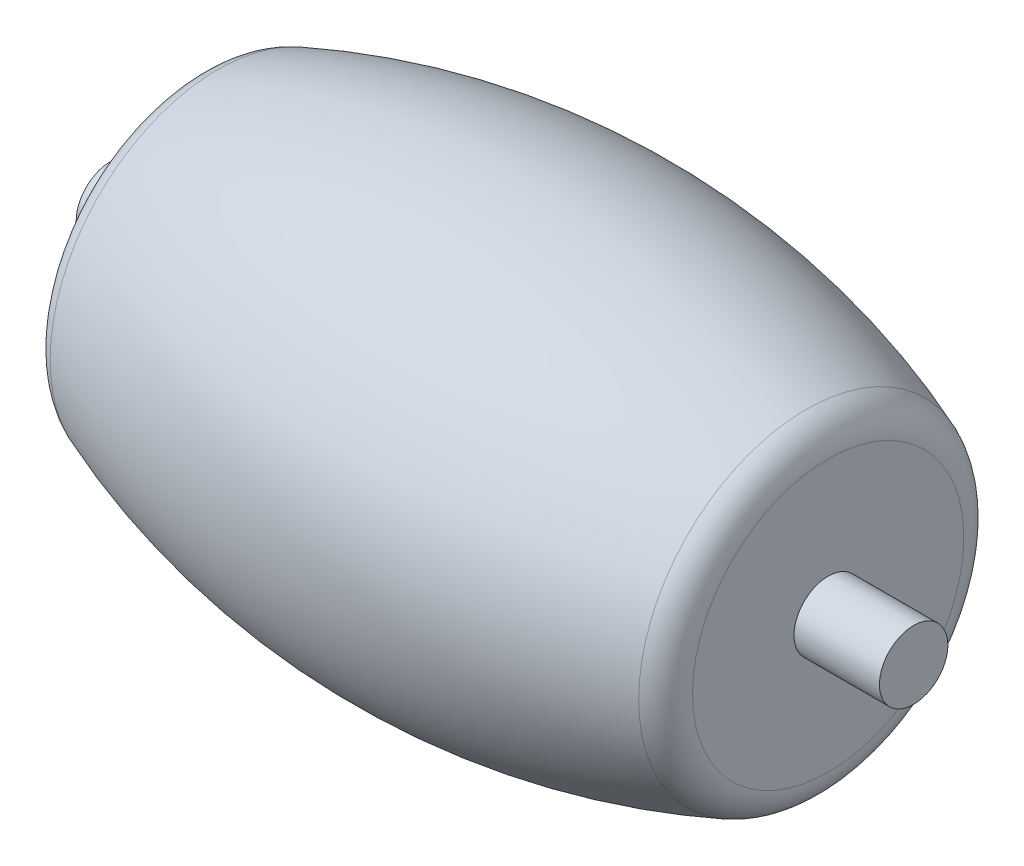
ISO-10303-21;
HEADER;
FILE_DESCRIPTION(('STEP AP214'),'2;1');
FILE_NAME('part.step','',(''),(''),'','','');
FILE_SCHEMA(('AUTOMOTIVE_DESIGN { 1 0 10303 214 1 1 1 1 }'));
ENDSEC;
DATA;
#1=APPLICATION_CONTEXT('core data for automotive mechanical design processes');
#2=APPLICATION_PROTOCOL_DEFINITION('international standard','automotive_design',2000,#1);
#3=PRODUCT_CONTEXT('',#1,'mechanical');
#4=PRODUCT('Part','Part','',(#3));
#5=PRODUCT_RELATED_PRODUCT_CATEGORY('part','',(#4));
#6=PRODUCT_DEFINITION_FORMATION('','',#4);
#7=PRODUCT_DEFINITION_CONTEXT('part definition',#1,'design');
#8=PRODUCT_DEFINITION('design','',#6,#7);
#9=PRODUCT_DEFINITION_SHAPE('','',#8);
#10=(LENGTH_UNIT() NAMED_UNIT(*) SI_UNIT(.MILLI.,.METRE.));
#11=(NAMED_UNIT(*) PLANE_ANGLE_UNIT() SI_UNIT($,.RADIAN.));
#12=(NAMED_UNIT(*) SI_UNIT($,.STERADIAN.) SOLID_ANGLE_UNIT());
#13=UNCERTAINTY_MEASURE_WITH_UNIT(LENGTH_MEASURE(1.E-05),#10,'distance_accuracy_value','');
#14=(GEOMETRIC_REPRESENTATION_CONTEXT(3) GLOBAL_UNCERTAINTY_ASSIGNED_CONTEXT((#13)) GLOBAL_UNIT_ASSIGNED_CONTEXT((#10,
#11,#12)) REPRESENTATION_CONTEXT('',''));
#15=CARTESIAN_POINT('',(0.,0.,0.));
#16=DIRECTION('',(0.,0.,1.));
#17=DIRECTION('',(1.,0.,0.));
#18=AXIS2_PLACEMENT_3D('',#15,#16,#17);
#19=CARTESIAN_POINT('',(0.,17.5,0.));
#20=DIRECTION('',(-1.,0.,0.));
#21=DIRECTION('',(0.,0.,1.));
#22=AXIS2_PLACEMENT_3D('',#19,#20,#21);
#23=DEGENERATE_TOROIDAL_SURFACE('',#22,17.5,24.,.F.);
#24=CARTESIAN_POINT('',(-8.60869565217391,17.5,0.));
#25=DIRECTION('',(1.,0.,0.));
#26=DIRECTION('',(0.,0.,-1.));
#27=AXIS2_PLACEMENT_3D('',#24,#25,#26);
#28=CIRCLE('',#27,4.90290961389261);
#29=CARTESIAN_POINT('',(-8.60869565217391,17.5,-4.90290961389261));
#30=VERTEX_POINT('',#29);
#31=EDGE_CURVE('E48',#30,#30,#28,.T.);
#32=ORIENTED_EDGE('',*,*,#31,.T.);
#33=EDGE_LOOP('',(#32));
#34=FACE_BOUND('',#33,.T.);
#35=CARTESIAN_POINT('',(8.60869565217391,17.5,0.));
#36=DIRECTION('',(-1.,0.,0.));
#37=DIRECTION('',(0.,0.,1.));
#38=AXIS2_PLACEMENT_3D('',#35,#36,#37);
#39=CIRCLE('',#38,4.90290961389261);
#40=CARTESIAN_POINT('',(8.60869565217391,17.5,4.90290961389261));
#41=VERTEX_POINT('',#40);
#42=EDGE_CURVE('E53',#41,#41,#39,.T.);
#43=ORIENTED_EDGE('',*,*,#42,.T.);
#44=EDGE_LOOP('',(#43));
#45=FACE_BOUND('',#44,.T.);
#46=ADVANCED_FACE('F39',(#34,#45),#23,.F.);
#47=CARTESIAN_POINT('',(-9.25,22.145823534021,0.));
#48=DIRECTION('',(1.,0.,0.));
#49=DIRECTION('',(0.,0.,-1.));
#50=AXIS2_PLACEMENT_3D('',#47,#48,#49);
#51=PLANE('',#50);
#52=CARTESIAN_POINT('',(-9.25,17.5,0.));
#53=DIRECTION('',(1.,0.,0.));
#54=DIRECTION('',(0.,0.,-1.));
#55=AXIS2_PLACEMENT_3D('',#52,#53,#54);
#56=CIRCLE('',#55,1.);
#57=CARTESIAN_POINT('',(-9.25,17.5,-1.));
#58=VERTEX_POINT('',#57);
#59=EDGE_CURVE('E63',#58,#58,#56,.T.);
#60=ORIENTED_EDGE('',*,*,#59,.T.);
#61=EDGE_LOOP('',(#60));
#62=FACE_BOUND('',#61,.T.);
#63=CARTESIAN_POINT('',(-9.25,17.5,0.));
#64=DIRECTION('',(1.,0.,0.));
#65=DIRECTION('',(0.,0.,-1.));
#66=AXIS2_PLACEMENT_3D('',#63,#64,#65);
#67=CIRCLE('',#66,3.96945504664709);
#68=CARTESIAN_POINT('',(-9.25,17.5,-3.96945504664709));
#69=VERTEX_POINT('',#68);
#70=EDGE_CURVE('E59',#69,#69,#67,.F.);
#71=ORIENTED_EDGE('',*,*,#70,.T.);
#72=EDGE_LOOP('',(#71));
#73=FACE_BOUND('',#72,.T.);
#74=ADVANCED_FACE('F85',(#62,#73),#51,.F.);
#75=CARTESIAN_POINT('',(9.25,22.145823534021,0.));
#76=DIRECTION('',(-1.,0.,0.));
#77=DIRECTION('',(0.,0.,1.));
#78=AXIS2_PLACEMENT_3D('',#75,#76,#77);
#79=PLANE('',#78);
#80=CARTESIAN_POINT('',(9.25,17.5,0.));
#81=DIRECTION('',(-1.,0.,0.));
#82=DIRECTION('',(0.,0.,1.));
#83=AXIS2_PLACEMENT_3D('',#80,#81,#82);
#84=CIRCLE('',#83,1.);
#85=CARTESIAN_POINT('',(9.25,17.5,1.));
#86=VERTEX_POINT('',#85);
#87=EDGE_CURVE('E43',#86,#86,#84,.T.);
#88=ORIENTED_EDGE('',*,*,#87,.T.);
#89=EDGE_LOOP('',(#88));
#90=FACE_BOUND('',#89,.T.);
#91=CARTESIAN_POINT('',(9.25,17.5,0.));
#92=DIRECTION('',(-1.,0.,0.));
#93=DIRECTION('',(0.,0.,1.));
#94=AXIS2_PLACEMENT_3D('',#91,#92,#93);
#95=CIRCLE('',#94,3.96945504664709);
#96=CARTESIAN_POINT('',(9.25,17.5,3.96945504664709));
#97=VERTEX_POINT('',#96);
#98=EDGE_CURVE('E10',#97,#97,#95,.F.);
#99=ORIENTED_EDGE('',*,*,#98,.T.);
#100=EDGE_LOOP('',(#99));
#101=FACE_BOUND('',#100,.T.);
#102=ADVANCED_FACE('F88',(#90,#101),#79,.F.);
#103=CARTESIAN_POINT('',(-8.25,17.5,0.));
#104=DIRECTION('',(1.,0.,0.));
#105=DIRECTION('',(0.,0.,-1.));
#106=AXIS2_PLACEMENT_3D('',#103,#104,#105);
#107=TOROIDAL_SURFACE('',#106,3.96945504664709,1.);
#108=ORIENTED_EDGE('',*,*,#31,.F.);
#109=EDGE_LOOP('',(#108));
#110=FACE_BOUND('',#109,.T.);
#111=ORIENTED_EDGE('',*,*,#70,.F.);
#112=EDGE_LOOP('',(#111));
#113=FACE_BOUND('',#112,.T.);
#114=ADVANCED_FACE('F92',(#110,#113),#107,.T.);
#115=CARTESIAN_POINT('',(8.25,17.5,0.));
#116=DIRECTION('',(-1.,0.,0.));
#117=DIRECTION('',(0.,0.,1.));
#118=AXIS2_PLACEMENT_3D('',#115,#116,#117);
#119=TOROIDAL_SURFACE('',#118,3.96945504664709,1.);
#120=ORIENTED_EDGE('',*,*,#98,.F.);
#121=EDGE_LOOP('',(#120));
#122=FACE_BOUND('',#121,.T.);
#123=ORIENTED_EDGE('',*,*,#42,.F.);
#124=EDGE_LOOP('',(#123));
#125=FACE_BOUND('',#124,.T.);
#126=ADVANCED_FACE('F41',(#122,#125),#119,.T.);
#127=CARTESIAN_POINT('',(11.75,17.5,0.));
#128=DIRECTION('',(-1.,0.,0.));
#129=DIRECTION('',(0.,0.,1.));
#130=AXIS2_PLACEMENT_3D('',#127,#128,#129);
#131=PLANE('',#130);
#132=CARTESIAN_POINT('',(11.75,17.5,0.));
#133=DIRECTION('',(-1.,0.,0.));
#134=DIRECTION('',(0.,0.,1.));
#135=AXIS2_PLACEMENT_3D('',#132,#133,#134);
#136=CIRCLE('',#135,1.);
#137=CARTESIAN_POINT('',(11.75,17.5,1.));
#138=VERTEX_POINT('',#137);
#139=EDGE_CURVE('E67',#138,#138,#136,.T.);
#140=ORIENTED_EDGE('',*,*,#139,.F.);
#141=EDGE_LOOP('',(#140));
#142=FACE_BOUND('',#141,.T.);
#143=ADVANCED_FACE('F99',(#142),#131,.F.);
#144=CARTESIAN_POINT('',(11.75,17.5,0.));
#145=DIRECTION('',(-1.,0.,0.));
#146=DIRECTION('',(0.,0.,1.));
#147=AXIS2_PLACEMENT_3D('',#144,#145,#146);
#148=CYLINDRICAL_SURFACE('',#147,1.);
#149=ORIENTED_EDGE('',*,*,#139,.T.);
#150=EDGE_LOOP('',(#149));
#151=FACE_BOUND('',#150,.T.);
#152=ORIENTED_EDGE('',*,*,#87,.F.);
#153=EDGE_LOOP('',(#152));
#154=FACE_BOUND('',#153,.T.);
#155=ADVANCED_FACE('F81',(#151,#154),#148,.T.);
#156=CARTESIAN_POINT('',(-11.75,17.5,0.));
#157=DIRECTION('',(-1.,0.,0.));
#158=DIRECTION('',(0.,0.,1.));
#159=AXIS2_PLACEMENT_3D('',#156,#157,#158);
#160=CIRCLE('',#159,1.);
#161=CARTESIAN_POINT('',(-11.75,17.5,1.));
#162=VERTEX_POINT('',#161);
#163=EDGE_CURVE('E71',#162,#162,#160,.T.);
#164=ORIENTED_EDGE('',*,*,#163,.F.);
#165=EDGE_LOOP('',(#164));
#166=FACE_BOUND('',#165,.T.);
#167=ORIENTED_EDGE('',*,*,#59,.F.);
#168=EDGE_LOOP('',(#167));
#169=FACE_BOUND('',#168,.T.);
#170=ADVANCED_FACE('F78',(#166,#169),#148,.T.);
#171=CARTESIAN_POINT('',(-11.75,17.5,0.));
#172=DIRECTION('',(-1.,0.,0.));
#173=DIRECTION('',(0.,0.,1.));
#174=AXIS2_PLACEMENT_3D('',#171,#172,#173);
#175=PLANE('',#174);
#176=ORIENTED_EDGE('',*,*,#163,.T.);
#177=EDGE_LOOP('',(#176));
#178=FACE_BOUND('',#177,.T.);
#179=ADVANCED_FACE('F76',(#178),#175,.T.);
#180=CLOSED_SHELL('',(#46,#74,#102,#114,#126,#143,#155,#170,#179));
#181=MANIFOLD_SOLID_BREP('B2',#180);
#182=ADVANCED_BREP_SHAPE_REPRESENTATION('',(#18,#181),#14);
#183=SHAPE_DEFINITION_REPRESENTATION(#9,#182);
ENDSEC;
END-ISO-10303-21;
